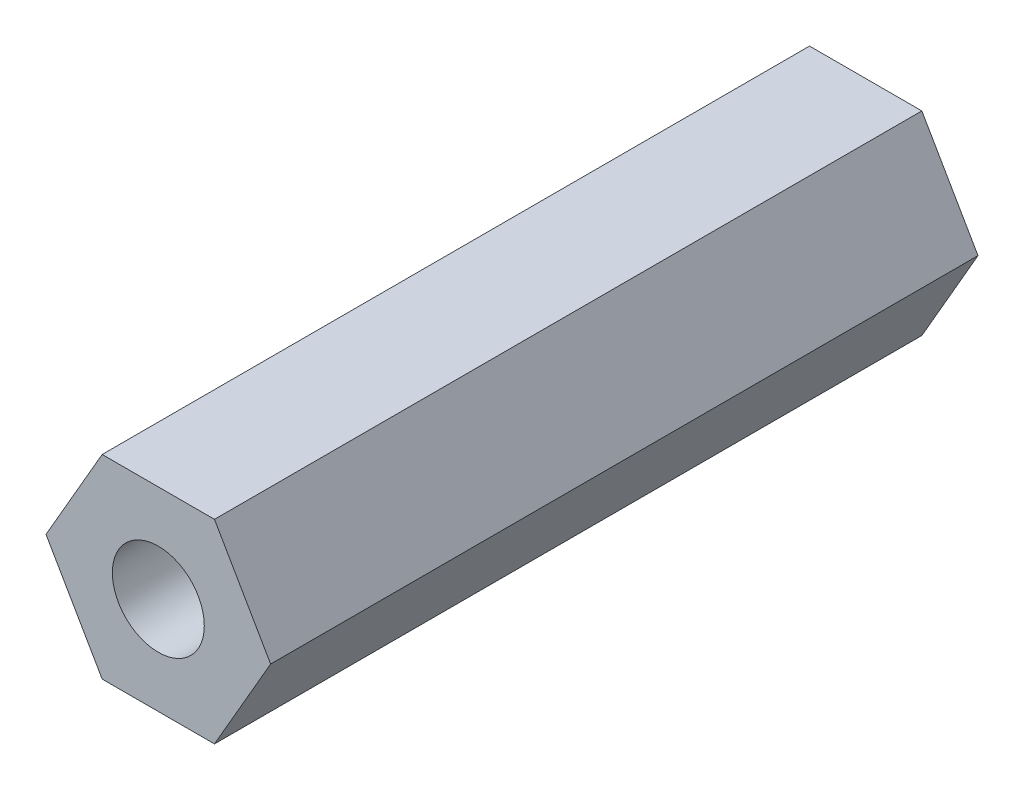
ISO-10303-21;
HEADER;
FILE_DESCRIPTION(('STEP AP214'),'2;1');
FILE_NAME('part.step','',(''),(''),'','','');
FILE_SCHEMA(('AUTOMOTIVE_DESIGN { 1 0 10303 214 1 1 1 1 }'));
ENDSEC;
DATA;
#1=APPLICATION_CONTEXT('core data for automotive mechanical design processes');
#2=APPLICATION_PROTOCOL_DEFINITION('international standard','automotive_design',2000,#1);
#3=PRODUCT_CONTEXT('',#1,'mechanical');
#4=PRODUCT('Part','Part','',(#3));
#5=PRODUCT_RELATED_PRODUCT_CATEGORY('part','',(#4));
#6=PRODUCT_DEFINITION_FORMATION('','',#4);
#7=PRODUCT_DEFINITION_CONTEXT('part definition',#1,'design');
#8=PRODUCT_DEFINITION('design','',#6,#7);
#9=PRODUCT_DEFINITION_SHAPE('','',#8);
#10=(LENGTH_UNIT() NAMED_UNIT(*) SI_UNIT(.MILLI.,.METRE.));
#11=(NAMED_UNIT(*) PLANE_ANGLE_UNIT() SI_UNIT($,.RADIAN.));
#12=(NAMED_UNIT(*) SI_UNIT($,.STERADIAN.) SOLID_ANGLE_UNIT());
#13=UNCERTAINTY_MEASURE_WITH_UNIT(LENGTH_MEASURE(1.E-05),#10,'distance_accuracy_value','');
#14=(GEOMETRIC_REPRESENTATION_CONTEXT(3) GLOBAL_UNCERTAINTY_ASSIGNED_CONTEXT((#13)) GLOBAL_UNIT_ASSIGNED_CONTEXT((#10,
#11,#12)) REPRESENTATION_CONTEXT('',''));
#15=CARTESIAN_POINT('',(0.,0.,0.));
#16=DIRECTION('',(0.,0.,1.));
#17=DIRECTION('',(1.,0.,0.));
#18=AXIS2_PLACEMENT_3D('',#15,#16,#17);
#19=CARTESIAN_POINT('',(0.,0.,20.));
#20=DIRECTION('',(0.,0.,1.));
#21=DIRECTION('',(1.,0.,0.));
#22=AXIS2_PLACEMENT_3D('',#19,#20,#21);
#23=PLANE('',#22);
#24=DIRECTION('',(-0.5,0.866025403784438,0.));
#25=VECTOR('',#24,1.);
#26=CARTESIAN_POINT('',(3.17542648054294,0.,20.));
#27=LINE('',#26,#25);
#28=CARTESIAN_POINT('',(3.17542648054294,0.,20.));
#29=VERTEX_POINT('',#28);
#30=CARTESIAN_POINT('',(1.58771324027147,2.75,20.));
#31=VERTEX_POINT('',#30);
#32=EDGE_CURVE('E146',#29,#31,#27,.T.);
#33=ORIENTED_EDGE('',*,*,#32,.T.);
#34=DIRECTION('',(-1.,0.,0.));
#35=VECTOR('',#34,1.);
#36=CARTESIAN_POINT('',(1.58771324027147,2.75,20.));
#37=LINE('',#36,#35);
#38=CARTESIAN_POINT('',(-1.58771324027147,2.75,20.));
#39=VERTEX_POINT('',#38);
#40=EDGE_CURVE('E94',#31,#39,#37,.T.);
#41=ORIENTED_EDGE('',*,*,#40,.T.);
#42=DIRECTION('',(-0.5,-0.866025403784439,0.));
#43=VECTOR('',#42,1.);
#44=CARTESIAN_POINT('',(-1.58771324027147,2.75,20.));
#45=LINE('',#44,#43);
#46=CARTESIAN_POINT('',(-3.17542648054294,0.,20.));
#47=VERTEX_POINT('',#46);
#48=EDGE_CURVE('E107',#39,#47,#45,.T.);
#49=ORIENTED_EDGE('',*,*,#48,.T.);
#50=DIRECTION('',(0.5,-0.866025403784438,0.));
#51=VECTOR('',#50,1.);
#52=CARTESIAN_POINT('',(-3.17542648054294,0.,20.));
#53=LINE('',#52,#51);
#54=CARTESIAN_POINT('',(-1.58771324027147,-2.75,20.));
#55=VERTEX_POINT('',#54);
#56=EDGE_CURVE('E101',#47,#55,#53,.T.);
#57=ORIENTED_EDGE('',*,*,#56,.T.);
#58=DIRECTION('',(1.,0.,0.));
#59=VECTOR('',#58,1.);
#60=CARTESIAN_POINT('',(-1.58771324027147,-2.75,20.));
#61=LINE('',#60,#59);
#62=CARTESIAN_POINT('',(1.58771324027147,-2.75,20.));
#63=VERTEX_POINT('',#62);
#64=EDGE_CURVE('E105',#55,#63,#61,.T.);
#65=ORIENTED_EDGE('',*,*,#64,.T.);
#66=DIRECTION('',(0.5,0.866025403784439,0.));
#67=VECTOR('',#66,1.);
#68=CARTESIAN_POINT('',(1.58771324027147,-2.75,20.));
#69=LINE('',#68,#67);
#70=EDGE_CURVE('E57',#63,#29,#69,.T.);
#71=ORIENTED_EDGE('',*,*,#70,.T.);
#72=EDGE_LOOP('',(#33,#41,#49,#57,#65,#71));
#73=FACE_BOUND('',#72,.T.);
#74=CARTESIAN_POINT('',(0.,0.,20.));
#75=DIRECTION('',(0.,0.,1.));
#76=DIRECTION('',(1.,0.,0.));
#77=AXIS2_PLACEMENT_3D('',#74,#75,#76);
#78=CIRCLE('',#77,1.3);
#79=CARTESIAN_POINT('',(1.3,0.,20.));
#80=VERTEX_POINT('',#79);
#81=EDGE_CURVE('E134',#80,#80,#78,.T.);
#82=ORIENTED_EDGE('',*,*,#81,.F.);
#83=EDGE_LOOP('',(#82));
#84=FACE_BOUND('',#83,.T.);
#85=ADVANCED_FACE('F39',(#73,#84),#23,.T.);
#86=CARTESIAN_POINT('',(0.,0.,0.));
#87=DIRECTION('',(0.,0.,1.));
#88=DIRECTION('',(1.,0.,0.));
#89=AXIS2_PLACEMENT_3D('',#86,#87,#88);
#90=PLANE('',#89);
#91=DIRECTION('',(-0.5,0.866025403784438,0.));
#92=VECTOR('',#91,1.);
#93=CARTESIAN_POINT('',(3.17542648054294,0.,0.));
#94=LINE('',#93,#92);
#95=CARTESIAN_POINT('',(3.17542648054294,0.,0.));
#96=VERTEX_POINT('',#95);
#97=CARTESIAN_POINT('',(1.58771324027147,2.75,0.));
#98=VERTEX_POINT('',#97);
#99=EDGE_CURVE('E129',#96,#98,#94,.T.);
#100=ORIENTED_EDGE('',*,*,#99,.F.);
#101=DIRECTION('',(0.5,0.866025403784439,0.));
#102=VECTOR('',#101,1.);
#103=CARTESIAN_POINT('',(1.58771324027147,-2.75,0.));
#104=LINE('',#103,#102);
#105=CARTESIAN_POINT('',(1.58771324027147,-2.75,0.));
#106=VERTEX_POINT('',#105);
#107=EDGE_CURVE('E86',#106,#96,#104,.T.);
#108=ORIENTED_EDGE('',*,*,#107,.F.);
#109=DIRECTION('',(1.,0.,0.));
#110=VECTOR('',#109,1.);
#111=CARTESIAN_POINT('',(-1.58771324027147,-2.75,0.));
#112=LINE('',#111,#110);
#113=CARTESIAN_POINT('',(-1.58771324027147,-2.75,0.));
#114=VERTEX_POINT('',#113);
#115=EDGE_CURVE('E80',#114,#106,#112,.T.);
#116=ORIENTED_EDGE('',*,*,#115,.F.);
#117=DIRECTION('',(0.5,-0.866025403784438,0.));
#118=VECTOR('',#117,1.);
#119=CARTESIAN_POINT('',(-3.17542648054294,0.,0.));
#120=LINE('',#119,#118);
#121=CARTESIAN_POINT('',(-3.17542648054294,0.,0.));
#122=VERTEX_POINT('',#121);
#123=EDGE_CURVE('E116',#122,#114,#120,.T.);
#124=ORIENTED_EDGE('',*,*,#123,.F.);
#125=DIRECTION('',(-0.5,-0.866025403784439,0.));
#126=VECTOR('',#125,1.);
#127=CARTESIAN_POINT('',(-1.58771324027147,2.75,0.));
#128=LINE('',#127,#126);
#129=CARTESIAN_POINT('',(-1.58771324027147,2.75,0.));
#130=VERTEX_POINT('',#129);
#131=EDGE_CURVE('E137',#130,#122,#128,.T.);
#132=ORIENTED_EDGE('',*,*,#131,.F.);
#133=DIRECTION('',(-1.,0.,0.));
#134=VECTOR('',#133,1.);
#135=CARTESIAN_POINT('',(1.58771324027147,2.75,0.));
#136=LINE('',#135,#134);
#137=EDGE_CURVE('E133',#98,#130,#136,.T.);
#138=ORIENTED_EDGE('',*,*,#137,.F.);
#139=EDGE_LOOP('',(#100,#108,#116,#124,#132,#138));
#140=FACE_BOUND('',#139,.T.);
#141=CARTESIAN_POINT('',(0.,0.,0.));
#142=DIRECTION('',(0.,0.,1.));
#143=DIRECTION('',(1.,0.,0.));
#144=AXIS2_PLACEMENT_3D('',#141,#142,#143);
#145=CIRCLE('',#144,1.3);
#146=CARTESIAN_POINT('',(1.3,0.,0.));
#147=VERTEX_POINT('',#146);
#148=EDGE_CURVE('E243',#147,#147,#145,.T.);
#149=ORIENTED_EDGE('',*,*,#148,.T.);
#150=EDGE_LOOP('',(#149));
#151=FACE_BOUND('',#150,.T.);
#152=ADVANCED_FACE('F159',(#140,#151),#90,.F.);
#153=CARTESIAN_POINT('',(3.17542648054294,0.,20.));
#154=DIRECTION('',(-0.866025403784438,-0.5,0.));
#155=DIRECTION('',(0.5,-0.866025403784439,0.));
#156=AXIS2_PLACEMENT_3D('',#153,#154,#155);
#157=PLANE('',#156);
#158=ORIENTED_EDGE('',*,*,#99,.T.);
#159=DIRECTION('',(0.,0.,-1.));
#160=VECTOR('',#159,1.);
#161=CARTESIAN_POINT('',(1.58771324027147,2.75,20.));
#162=LINE('',#161,#160);
#163=EDGE_CURVE('E11',#31,#98,#162,.T.);
#164=ORIENTED_EDGE('',*,*,#163,.F.);
#165=ORIENTED_EDGE('',*,*,#32,.F.);
#166=DIRECTION('',(0.,0.,-1.));
#167=VECTOR('',#166,1.);
#168=CARTESIAN_POINT('',(3.17542648054294,0.,20.));
#169=LINE('',#168,#167);
#170=EDGE_CURVE('E125',#29,#96,#169,.T.);
#171=ORIENTED_EDGE('',*,*,#170,.T.);
#172=EDGE_LOOP('',(#158,#164,#165,#171));
#173=FACE_BOUND('',#172,.T.);
#174=ADVANCED_FACE('F41',(#173),#157,.F.);
#175=CARTESIAN_POINT('',(1.58771324027147,2.75,20.));
#176=DIRECTION('',(0.,-1.,0.));
#177=DIRECTION('',(1.,0.,0.));
#178=AXIS2_PLACEMENT_3D('',#175,#176,#177);
#179=PLANE('',#178);
#180=ORIENTED_EDGE('',*,*,#137,.T.);
#181=DIRECTION('',(0.,0.,-1.));
#182=VECTOR('',#181,1.);
#183=CARTESIAN_POINT('',(-1.58771324027147,2.75,20.));
#184=LINE('',#183,#182);
#185=EDGE_CURVE('E49',#39,#130,#184,.T.);
#186=ORIENTED_EDGE('',*,*,#185,.F.);
#187=ORIENTED_EDGE('',*,*,#40,.F.);
#188=ORIENTED_EDGE('',*,*,#163,.T.);
#189=EDGE_LOOP('',(#180,#186,#187,#188));
#190=FACE_BOUND('',#189,.T.);
#191=ADVANCED_FACE('F184',(#190),#179,.F.);
#192=CARTESIAN_POINT('',(-1.58771324027147,2.75,20.));
#193=DIRECTION('',(0.866025403784439,-0.5,0.));
#194=DIRECTION('',(0.5,0.866025403784439,0.));
#195=AXIS2_PLACEMENT_3D('',#192,#193,#194);
#196=PLANE('',#195);
#197=ORIENTED_EDGE('',*,*,#131,.T.);
#198=DIRECTION('',(0.,0.,-1.));
#199=VECTOR('',#198,1.);
#200=CARTESIAN_POINT('',(-3.17542648054294,0.,20.));
#201=LINE('',#200,#199);
#202=EDGE_CURVE('E118',#47,#122,#201,.T.);
#203=ORIENTED_EDGE('',*,*,#202,.F.);
#204=ORIENTED_EDGE('',*,*,#48,.F.);
#205=ORIENTED_EDGE('',*,*,#185,.T.);
#206=EDGE_LOOP('',(#197,#203,#204,#205));
#207=FACE_BOUND('',#206,.T.);
#208=ADVANCED_FACE('F156',(#207),#196,.F.);
#209=CARTESIAN_POINT('',(-3.17542648054294,0.,20.));
#210=DIRECTION('',(0.866025403784438,0.5,0.));
#211=DIRECTION('',(-0.5,0.866025403784438,0.));
#212=AXIS2_PLACEMENT_3D('',#209,#210,#211);
#213=PLANE('',#212);
#214=ORIENTED_EDGE('',*,*,#123,.T.);
#215=DIRECTION('',(0.,0.,-1.));
#216=VECTOR('',#215,1.);
#217=CARTESIAN_POINT('',(-1.58771324027147,-2.75,20.));
#218=LINE('',#217,#216);
#219=EDGE_CURVE('E113',#55,#114,#218,.T.);
#220=ORIENTED_EDGE('',*,*,#219,.F.);
#221=ORIENTED_EDGE('',*,*,#56,.F.);
#222=ORIENTED_EDGE('',*,*,#202,.T.);
#223=EDGE_LOOP('',(#214,#220,#221,#222));
#224=FACE_BOUND('',#223,.T.);
#225=ADVANCED_FACE('F114',(#224),#213,.F.);
#226=CARTESIAN_POINT('',(-1.58771324027147,-2.75,20.));
#227=DIRECTION('',(0.,1.,0.));
#228=DIRECTION('',(-1.,0.,0.));
#229=AXIS2_PLACEMENT_3D('',#226,#227,#228);
#230=PLANE('',#229);
#231=ORIENTED_EDGE('',*,*,#115,.T.);
#232=DIRECTION('',(0.,0.,-1.));
#233=VECTOR('',#232,1.);
#234=CARTESIAN_POINT('',(1.58771324027147,-2.75,20.));
#235=LINE('',#234,#233);
#236=EDGE_CURVE('E119',#63,#106,#235,.T.);
#237=ORIENTED_EDGE('',*,*,#236,.F.);
#238=ORIENTED_EDGE('',*,*,#64,.F.);
#239=ORIENTED_EDGE('',*,*,#219,.T.);
#240=EDGE_LOOP('',(#231,#237,#238,#239));
#241=FACE_BOUND('',#240,.T.);
#242=ADVANCED_FACE('F121',(#241),#230,.F.);
#243=CARTESIAN_POINT('',(1.58771324027147,-2.75,20.));
#244=DIRECTION('',(-0.866025403784439,0.5,0.));
#245=DIRECTION('',(-0.5,-0.866025403784439,0.));
#246=AXIS2_PLACEMENT_3D('',#243,#244,#245);
#247=PLANE('',#246);
#248=ORIENTED_EDGE('',*,*,#107,.T.);
#249=ORIENTED_EDGE('',*,*,#170,.F.);
#250=ORIENTED_EDGE('',*,*,#70,.F.);
#251=ORIENTED_EDGE('',*,*,#236,.T.);
#252=EDGE_LOOP('',(#248,#249,#250,#251));
#253=FACE_BOUND('',#252,.T.);
#254=ADVANCED_FACE('F164',(#253),#247,.F.);
#255=CARTESIAN_POINT('',(0.,0.,20.));
#256=DIRECTION('',(0.,0.,-1.));
#257=DIRECTION('',(-1.,0.,0.));
#258=AXIS2_PLACEMENT_3D('',#255,#256,#257);
#259=CYLINDRICAL_SURFACE('',#258,1.3);
#260=ORIENTED_EDGE('',*,*,#81,.T.);
#261=EDGE_LOOP('',(#260));
#262=FACE_BOUND('',#261,.T.);
#263=ORIENTED_EDGE('',*,*,#148,.F.);
#264=EDGE_LOOP('',(#263));
#265=FACE_BOUND('',#264,.T.);
#266=ADVANCED_FACE('F166',(#262,#265),#259,.F.);
#267=CLOSED_SHELL('',(#85,#152,#174,#191,#208,#225,#242,#254,#266));
#268=MANIFOLD_SOLID_BREP('B2',#267);
#269=ADVANCED_BREP_SHAPE_REPRESENTATION('',(#18,#268),#14);
#270=SHAPE_DEFINITION_REPRESENTATION(#9,#269);
ENDSEC;
END-ISO-10303-21;
